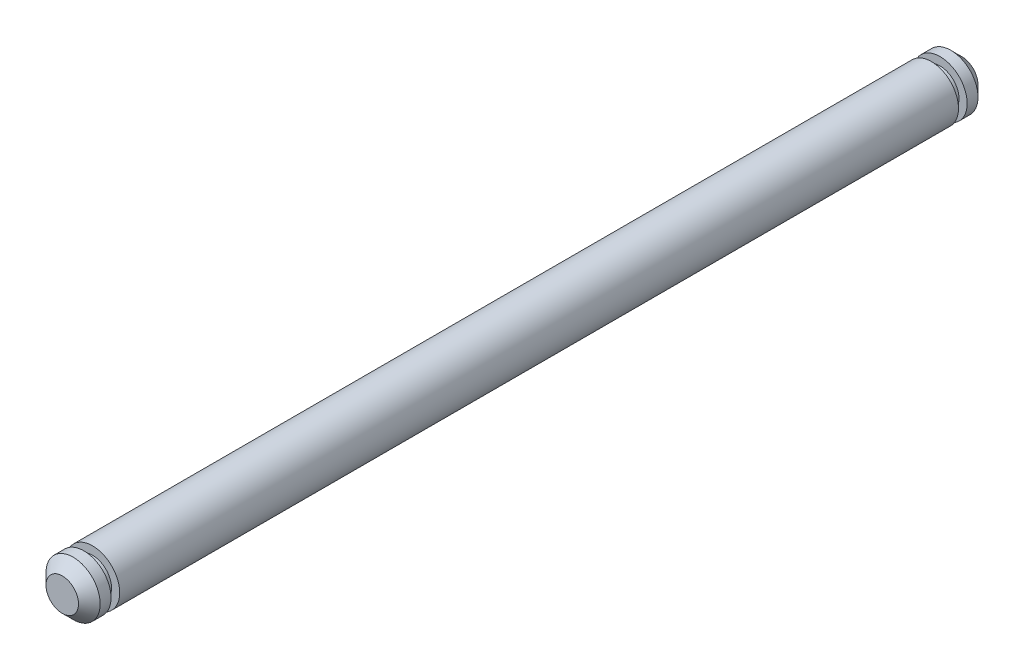
ISO-10303-21;
HEADER;
FILE_DESCRIPTION(('STEP AP214'),'2;1');
FILE_NAME('part.step','',(''),(''),'','','');
FILE_SCHEMA(('AUTOMOTIVE_DESIGN { 1 0 10303 214 1 1 1 1 }'));
ENDSEC;
DATA;
#1=APPLICATION_CONTEXT('core data for automotive mechanical design processes');
#2=APPLICATION_PROTOCOL_DEFINITION('international standard','automotive_design',2000,#1);
#3=PRODUCT_CONTEXT('',#1,'mechanical');
#4=PRODUCT('Part','Part','',(#3));
#5=PRODUCT_RELATED_PRODUCT_CATEGORY('part','',(#4));
#6=PRODUCT_DEFINITION_FORMATION('','',#4);
#7=PRODUCT_DEFINITION_CONTEXT('part definition',#1,'design');
#8=PRODUCT_DEFINITION('design','',#6,#7);
#9=PRODUCT_DEFINITION_SHAPE('','',#8);
#10=(LENGTH_UNIT() NAMED_UNIT(*) SI_UNIT(.MILLI.,.METRE.));
#11=(NAMED_UNIT(*) PLANE_ANGLE_UNIT() SI_UNIT($,.RADIAN.));
#12=(NAMED_UNIT(*) SI_UNIT($,.STERADIAN.) SOLID_ANGLE_UNIT());
#13=UNCERTAINTY_MEASURE_WITH_UNIT(LENGTH_MEASURE(1.E-05),#10,'distance_accuracy_value','');
#14=(GEOMETRIC_REPRESENTATION_CONTEXT(3) GLOBAL_UNCERTAINTY_ASSIGNED_CONTEXT((#13)) GLOBAL_UNIT_ASSIGNED_CONTEXT((#10,
#11,#12)) REPRESENTATION_CONTEXT('',''));
#15=CARTESIAN_POINT('',(0.,0.,0.));
#16=DIRECTION('',(0.,0.,1.));
#17=DIRECTION('',(1.,0.,0.));
#18=AXIS2_PLACEMENT_3D('',#15,#16,#17);
#19=CARTESIAN_POINT('',(0.,0.,41.5));
#20=DIRECTION('',(0.,0.,-1.));
#21=DIRECTION('',(-1.,0.,0.));
#22=AXIS2_PLACEMENT_3D('',#19,#20,#21);
#23=CYLINDRICAL_SURFACE('',#22,2.5);
#24=CARTESIAN_POINT('',(0.,0.,38.7));
#25=DIRECTION('',(0.,0.,1.));
#26=DIRECTION('',(1.,0.,0.));
#27=AXIS2_PLACEMENT_3D('',#24,#25,#26);
#28=CIRCLE('',#27,2.5);
#29=CARTESIAN_POINT('',(2.5,0.,38.7));
#30=VERTEX_POINT('',#29);
#31=EDGE_CURVE('E77',#30,#30,#28,.T.);
#32=ORIENTED_EDGE('',*,*,#31,.F.);
#33=EDGE_LOOP('',(#32));
#34=FACE_BOUND('',#33,.T.);
#35=CARTESIAN_POINT('',(0.,0.,-38.7));
#36=DIRECTION('',(0.,0.,1.));
#37=DIRECTION('',(1.,0.,0.));
#38=AXIS2_PLACEMENT_3D('',#35,#36,#37);
#39=CIRCLE('',#38,2.5);
#40=CARTESIAN_POINT('',(2.5,0.,-38.7));
#41=VERTEX_POINT('',#40);
#42=EDGE_CURVE('E62',#41,#41,#39,.T.);
#43=ORIENTED_EDGE('',*,*,#42,.T.);
#44=EDGE_LOOP('',(#43));
#45=FACE_BOUND('',#44,.T.);
#46=ADVANCED_FACE('F33',(#34,#45),#23,.T.);
#47=CARTESIAN_POINT('',(0.,0.,-40.5));
#48=DIRECTION('',(0.,0.,1.));
#49=DIRECTION('',(1.,0.,0.));
#50=AXIS2_PLACEMENT_3D('',#47,#48,#49);
#51=CIRCLE('',#50,2.5);
#52=CARTESIAN_POINT('',(2.5,0.,-40.5));
#53=VERTEX_POINT('',#52);
#54=EDGE_CURVE('E48',#53,#53,#51,.T.);
#55=ORIENTED_EDGE('',*,*,#54,.T.);
#56=EDGE_LOOP('',(#55));
#57=FACE_BOUND('',#56,.T.);
#58=CARTESIAN_POINT('',(0.,0.,-39.5));
#59=DIRECTION('',(0.,0.,1.));
#60=DIRECTION('',(1.,0.,0.));
#61=AXIS2_PLACEMENT_3D('',#58,#59,#60);
#62=CIRCLE('',#61,2.5);
#63=CARTESIAN_POINT('',(2.5,0.,-39.5));
#64=VERTEX_POINT('',#63);
#65=EDGE_CURVE('E53',#64,#64,#62,.T.);
#66=ORIENTED_EDGE('',*,*,#65,.F.);
#67=EDGE_LOOP('',(#66));
#68=FACE_BOUND('',#67,.T.);
#69=ADVANCED_FACE('F86',(#57,#68),#23,.T.);
#70=CARTESIAN_POINT('',(0.,0.,-41.5));
#71=DIRECTION('',(0.,0.,1.));
#72=DIRECTION('',(1.,0.,0.));
#73=AXIS2_PLACEMENT_3D('',#70,#71,#72);
#74=PLANE('',#73);
#75=CARTESIAN_POINT('',(0.,0.,-41.5));
#76=DIRECTION('',(0.,0.,1.));
#77=DIRECTION('',(1.,0.,0.));
#78=AXIS2_PLACEMENT_3D('',#75,#76,#77);
#79=CIRCLE('',#78,1.49999999999997);
#80=CARTESIAN_POINT('',(1.49999999999997,0.,-41.5));
#81=VERTEX_POINT('',#80);
#82=EDGE_CURVE('E44',#81,#81,#79,.F.);
#83=ORIENTED_EDGE('',*,*,#82,.T.);
#84=EDGE_LOOP('',(#83));
#85=FACE_BOUND('',#84,.T.);
#86=ADVANCED_FACE('F106',(#85),#74,.F.);
#87=CARTESIAN_POINT('',(2.5,0.,-39.5));
#88=DIRECTION('',(0.,0.,-1.));
#89=DIRECTION('',(-1.,0.,0.));
#90=AXIS2_PLACEMENT_3D('',#87,#88,#89);
#91=PLANE('',#90);
#92=CARTESIAN_POINT('',(0.,0.,-39.5));
#93=DIRECTION('',(0.,0.,1.));
#94=DIRECTION('',(1.,0.,0.));
#95=AXIS2_PLACEMENT_3D('',#92,#93,#94);
#96=CIRCLE('',#95,1.75);
#97=CARTESIAN_POINT('',(1.75,0.,-39.5));
#98=VERTEX_POINT('',#97);
#99=EDGE_CURVE('E56',#98,#98,#96,.T.);
#100=ORIENTED_EDGE('',*,*,#99,.F.);
#101=EDGE_LOOP('',(#100));
#102=FACE_BOUND('',#101,.T.);
#103=ORIENTED_EDGE('',*,*,#65,.T.);
#104=EDGE_LOOP('',(#103));
#105=FACE_BOUND('',#104,.T.);
#106=ADVANCED_FACE('F100',(#102,#105),#91,.F.);
#107=CARTESIAN_POINT('',(0.,0.,49.4231491050816));
#108=DIRECTION('',(0.,0.,1.));
#109=DIRECTION('',(1.,0.,0.));
#110=AXIS2_PLACEMENT_3D('',#107,#108,#109);
#111=CYLINDRICAL_SURFACE('',#110,1.75);
#112=CARTESIAN_POINT('',(0.,0.,-38.7));
#113=DIRECTION('',(0.,0.,1.));
#114=DIRECTION('',(1.,0.,0.));
#115=AXIS2_PLACEMENT_3D('',#112,#113,#114);
#116=CIRCLE('',#115,1.75);
#117=CARTESIAN_POINT('',(1.75,0.,-38.7));
#118=VERTEX_POINT('',#117);
#119=EDGE_CURVE('E59',#118,#118,#116,.T.);
#120=ORIENTED_EDGE('',*,*,#119,.F.);
#121=EDGE_LOOP('',(#120));
#122=FACE_BOUND('',#121,.T.);
#123=ORIENTED_EDGE('',*,*,#99,.T.);
#124=EDGE_LOOP('',(#123));
#125=FACE_BOUND('',#124,.T.);
#126=ADVANCED_FACE('F94',(#122,#125),#111,.T.);
#127=CARTESIAN_POINT('',(2.5,0.,-38.7));
#128=DIRECTION('',(0.,0.,1.));
#129=DIRECTION('',(1.,0.,0.));
#130=AXIS2_PLACEMENT_3D('',#127,#128,#129);
#131=PLANE('',#130);
#132=ORIENTED_EDGE('',*,*,#42,.F.);
#133=EDGE_LOOP('',(#132));
#134=FACE_BOUND('',#133,.T.);
#135=ORIENTED_EDGE('',*,*,#119,.T.);
#136=EDGE_LOOP('',(#135));
#137=FACE_BOUND('',#136,.T.);
#138=ADVANCED_FACE('F91',(#134,#137),#131,.F.);
#139=CARTESIAN_POINT('',(2.5,0.,38.7));
#140=DIRECTION('',(0.,0.,-1.));
#141=DIRECTION('',(-1.,0.,0.));
#142=AXIS2_PLACEMENT_3D('',#139,#140,#141);
#143=PLANE('',#142);
#144=CARTESIAN_POINT('',(0.,0.,38.7));
#145=DIRECTION('',(0.,0.,1.));
#146=DIRECTION('',(1.,0.,0.));
#147=AXIS2_PLACEMENT_3D('',#144,#145,#146);
#148=CIRCLE('',#147,1.75);
#149=CARTESIAN_POINT('',(1.75,0.,38.7));
#150=VERTEX_POINT('',#149);
#151=EDGE_CURVE('E65',#150,#150,#148,.T.);
#152=ORIENTED_EDGE('',*,*,#151,.F.);
#153=EDGE_LOOP('',(#152));
#154=FACE_BOUND('',#153,.T.);
#155=ORIENTED_EDGE('',*,*,#31,.T.);
#156=EDGE_LOOP('',(#155));
#157=FACE_BOUND('',#156,.T.);
#158=ADVANCED_FACE('F82',(#154,#157),#143,.F.);
#159=CARTESIAN_POINT('',(0.,0.,49.4231491050816));
#160=DIRECTION('',(0.,0.,1.));
#161=DIRECTION('',(1.,0.,0.));
#162=AXIS2_PLACEMENT_3D('',#159,#160,#161);
#163=CYLINDRICAL_SURFACE('',#162,1.75);
#164=CARTESIAN_POINT('',(0.,0.,39.5));
#165=DIRECTION('',(0.,0.,1.));
#166=DIRECTION('',(1.,0.,0.));
#167=AXIS2_PLACEMENT_3D('',#164,#165,#166);
#168=CIRCLE('',#167,1.75);
#169=CARTESIAN_POINT('',(1.75,0.,39.5));
#170=VERTEX_POINT('',#169);
#171=EDGE_CURVE('E69',#170,#170,#168,.T.);
#172=ORIENTED_EDGE('',*,*,#171,.F.);
#173=EDGE_LOOP('',(#172));
#174=FACE_BOUND('',#173,.T.);
#175=ORIENTED_EDGE('',*,*,#151,.T.);
#176=EDGE_LOOP('',(#175));
#177=FACE_BOUND('',#176,.T.);
#178=ADVANCED_FACE('F134',(#174,#177),#163,.T.);
#179=CARTESIAN_POINT('',(2.5,0.,39.5));
#180=DIRECTION('',(0.,0.,1.));
#181=DIRECTION('',(1.,0.,0.));
#182=AXIS2_PLACEMENT_3D('',#179,#180,#181);
#183=PLANE('',#182);
#184=CARTESIAN_POINT('',(0.,0.,39.5));
#185=DIRECTION('',(0.,0.,1.));
#186=DIRECTION('',(1.,0.,0.));
#187=AXIS2_PLACEMENT_3D('',#184,#185,#186);
#188=CIRCLE('',#187,2.5);
#189=CARTESIAN_POINT('',(2.5,0.,39.5));
#190=VERTEX_POINT('',#189);
#191=EDGE_CURVE('E73',#190,#190,#188,.T.);
#192=ORIENTED_EDGE('',*,*,#191,.F.);
#193=EDGE_LOOP('',(#192));
#194=FACE_BOUND('',#193,.T.);
#195=ORIENTED_EDGE('',*,*,#171,.T.);
#196=EDGE_LOOP('',(#195));
#197=FACE_BOUND('',#196,.T.);
#198=ADVANCED_FACE('F127',(#194,#197),#183,.F.);
#199=CARTESIAN_POINT('',(0.,0.,41.5));
#200=DIRECTION('',(0.,0.,1.));
#201=DIRECTION('',(1.,0.,0.));
#202=AXIS2_PLACEMENT_3D('',#199,#200,#201);
#203=PLANE('',#202);
#204=CARTESIAN_POINT('',(0.,0.,41.5));
#205=DIRECTION('',(0.,0.,1.));
#206=DIRECTION('',(1.,0.,0.));
#207=AXIS2_PLACEMENT_3D('',#204,#205,#206);
#208=CIRCLE('',#207,1.5);
#209=CARTESIAN_POINT('',(1.5,0.,41.5));
#210=VERTEX_POINT('',#209);
#211=EDGE_CURVE('E40',#210,#210,#208,.T.);
#212=ORIENTED_EDGE('',*,*,#211,.T.);
#213=EDGE_LOOP('',(#212));
#214=FACE_BOUND('',#213,.T.);
#215=ADVANCED_FACE('F120',(#214),#203,.T.);
#216=CARTESIAN_POINT('',(0.,0.,40.5));
#217=DIRECTION('',(0.,0.,1.));
#218=DIRECTION('',(1.,0.,0.));
#219=AXIS2_PLACEMENT_3D('',#216,#217,#218);
#220=CIRCLE('',#219,2.5);
#221=CARTESIAN_POINT('',(2.5,0.,40.5));
#222=VERTEX_POINT('',#221);
#223=EDGE_CURVE('E10',#222,#222,#220,.F.);
#224=ORIENTED_EDGE('',*,*,#223,.T.);
#225=EDGE_LOOP('',(#224));
#226=FACE_BOUND('',#225,.T.);
#227=ORIENTED_EDGE('',*,*,#191,.T.);
#228=EDGE_LOOP('',(#227));
#229=FACE_BOUND('',#228,.T.);
#230=ADVANCED_FACE('F88',(#226,#229),#23,.T.);
#231=CARTESIAN_POINT('',(0.,0.,-40.5));
#232=DIRECTION('',(0.,0.,1.));
#233=DIRECTION('',(1.,0.,0.));
#234=AXIS2_PLACEMENT_3D('',#231,#232,#233);
#235=CONICAL_SURFACE('',#234,2.5,0.785398163397455);
#236=ORIENTED_EDGE('',*,*,#82,.F.);
#237=EDGE_LOOP('',(#236));
#238=FACE_BOUND('',#237,.T.);
#239=ORIENTED_EDGE('',*,*,#54,.F.);
#240=EDGE_LOOP('',(#239));
#241=FACE_BOUND('',#240,.T.);
#242=ADVANCED_FACE('F119',(#238,#241),#235,.T.);
#243=CARTESIAN_POINT('',(0.,0.,41.5));
#244=DIRECTION('',(0.,0.,-1.));
#245=DIRECTION('',(-1.,0.,0.));
#246=AXIS2_PLACEMENT_3D('',#243,#244,#245);
#247=CONICAL_SURFACE('',#246,1.5,0.785398163397445);
#248=ORIENTED_EDGE('',*,*,#223,.F.);
#249=EDGE_LOOP('',(#248));
#250=FACE_BOUND('',#249,.T.);
#251=ORIENTED_EDGE('',*,*,#211,.F.);
#252=EDGE_LOOP('',(#251));
#253=FACE_BOUND('',#252,.T.);
#254=ADVANCED_FACE('F35',(#250,#253),#247,.T.);
#255=CLOSED_SHELL('',(#46,#69,#86,#106,#126,#138,#158,#178,#198,#215,#230,#242,#254));
#256=MANIFOLD_SOLID_BREP('B2',#255);
#257=ADVANCED_BREP_SHAPE_REPRESENTATION('',(#18,#256),#14);
#258=SHAPE_DEFINITION_REPRESENTATION(#9,#257);
ENDSEC;
END-ISO-10303-21;
